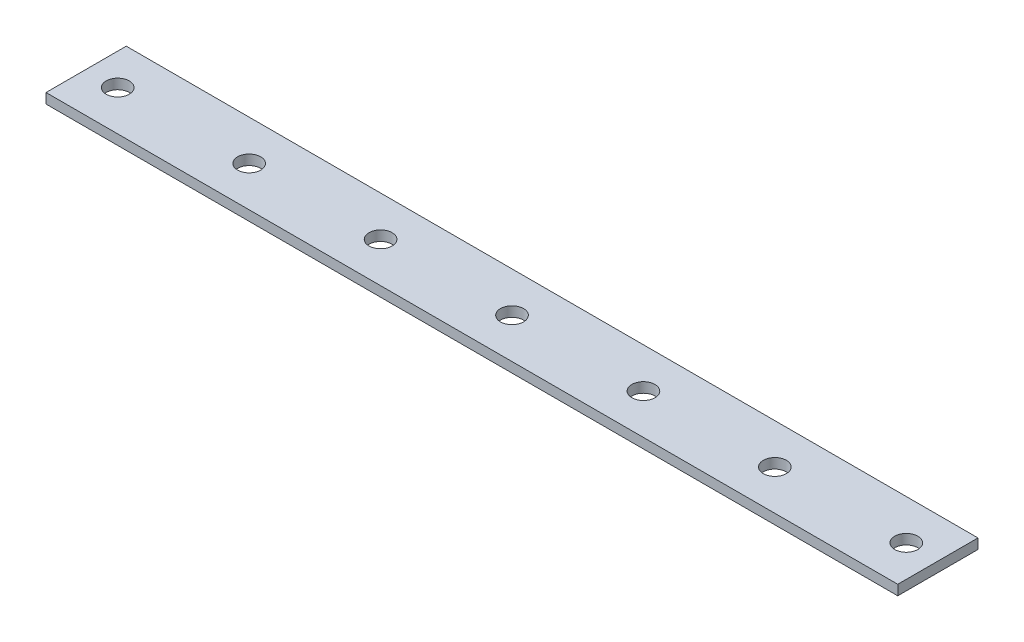
ISO-10303-21;
HEADER;
FILE_DESCRIPTION(('STEP AP214'),'2;1');
FILE_NAME('part.step','',(''),(''),'','','');
FILE_SCHEMA(('AUTOMOTIVE_DESIGN { 1 0 10303 214 1 1 1 1 }'));
ENDSEC;
DATA;
#1=APPLICATION_CONTEXT('core data for automotive mechanical design processes');
#2=APPLICATION_PROTOCOL_DEFINITION('international standard','automotive_design',2000,#1);
#3=PRODUCT_CONTEXT('',#1,'mechanical');
#4=PRODUCT('Part','Part','',(#3));
#5=PRODUCT_RELATED_PRODUCT_CATEGORY('part','',(#4));
#6=PRODUCT_DEFINITION_FORMATION('','',#4);
#7=PRODUCT_DEFINITION_CONTEXT('part definition',#1,'design');
#8=PRODUCT_DEFINITION('design','',#6,#7);
#9=PRODUCT_DEFINITION_SHAPE('','',#8);
#10=(LENGTH_UNIT() NAMED_UNIT(*) SI_UNIT(.MILLI.,.METRE.));
#11=(NAMED_UNIT(*) PLANE_ANGLE_UNIT() SI_UNIT($,.RADIAN.));
#12=(NAMED_UNIT(*) SI_UNIT($,.STERADIAN.) SOLID_ANGLE_UNIT());
#13=UNCERTAINTY_MEASURE_WITH_UNIT(LENGTH_MEASURE(1.E-05),#10,'distance_accuracy_value','');
#14=(GEOMETRIC_REPRESENTATION_CONTEXT(3) GLOBAL_UNCERTAINTY_ASSIGNED_CONTEXT((#13)) GLOBAL_UNIT_ASSIGNED_CONTEXT((#10,
#11,#12)) REPRESENTATION_CONTEXT('',''));
#15=CARTESIAN_POINT('',(0.,0.,0.));
#16=DIRECTION('',(0.,0.,1.));
#17=DIRECTION('',(1.,0.,0.));
#18=AXIS2_PLACEMENT_3D('',#15,#16,#17);
#19=CARTESIAN_POINT('',(0.,1.5875,0.));
#20=DIRECTION('',(0.,-1.,0.));
#21=DIRECTION('',(0.,0.,-1.));
#22=AXIS2_PLACEMENT_3D('',#19,#20,#21);
#23=PLANE('',#22);
#24=CARTESIAN_POINT('',(47.6,1.5875,-6.35));
#25=DIRECTION('',(0.,1.,0.));
#26=DIRECTION('',(0.,0.,1.));
#27=AXIS2_PLACEMENT_3D('',#24,#25,#26);
#28=CIRCLE('',#27,1.8288);
#29=CARTESIAN_POINT('',(47.6,1.5875,-4.52120000000001));
#30=VERTEX_POINT('',#29);
#31=EDGE_CURVE('E150',#30,#30,#28,.T.);
#32=ORIENTED_EDGE('',*,*,#31,.F.);
#33=EDGE_LOOP('',(#32));
#34=FACE_BOUND('',#33,.T.);
#35=CARTESIAN_POINT('',(68.4,1.5875,-6.35));
#36=DIRECTION('',(0.,1.,0.));
#37=DIRECTION('',(0.,0.,1.));
#38=AXIS2_PLACEMENT_3D('',#35,#36,#37);
#39=CIRCLE('',#38,1.8288);
#40=CARTESIAN_POINT('',(68.4,1.5875,-4.5212));
#41=VERTEX_POINT('',#40);
#42=EDGE_CURVE('E144',#41,#41,#39,.T.);
#43=ORIENTED_EDGE('',*,*,#42,.F.);
#44=EDGE_LOOP('',(#43));
#45=FACE_BOUND('',#44,.T.);
#46=CARTESIAN_POINT('',(89.2,1.5875,-6.35));
#47=DIRECTION('',(0.,1.,0.));
#48=DIRECTION('',(0.,0.,1.));
#49=AXIS2_PLACEMENT_3D('',#46,#47,#48);
#50=CIRCLE('',#49,1.8288);
#51=CARTESIAN_POINT('',(89.2,1.5875,-4.5212));
#52=VERTEX_POINT('',#51);
#53=EDGE_CURVE('E138',#52,#52,#50,.T.);
#54=ORIENTED_EDGE('',*,*,#53,.F.);
#55=EDGE_LOOP('',(#54));
#56=FACE_BOUND('',#55,.T.);
#57=CARTESIAN_POINT('',(110.,1.5875,-6.35));
#58=DIRECTION('',(0.,1.,0.));
#59=DIRECTION('',(0.,0.,1.));
#60=AXIS2_PLACEMENT_3D('',#57,#58,#59);
#61=CIRCLE('',#60,1.8288);
#62=CARTESIAN_POINT('',(110.,1.5875,-4.5212));
#63=VERTEX_POINT('',#62);
#64=EDGE_CURVE('E132',#63,#63,#61,.T.);
#65=ORIENTED_EDGE('',*,*,#64,.F.);
#66=EDGE_LOOP('',(#65));
#67=FACE_BOUND('',#66,.T.);
#68=CARTESIAN_POINT('',(26.8,1.5875,-6.35));
#69=DIRECTION('',(0.,1.,0.));
#70=DIRECTION('',(0.,0.,1.));
#71=AXIS2_PLACEMENT_3D('',#68,#69,#70);
#72=CIRCLE('',#71,1.8288);
#73=CARTESIAN_POINT('',(26.8,1.5875,-4.52120000000001));
#74=VERTEX_POINT('',#73);
#75=EDGE_CURVE('E126',#74,#74,#72,.T.);
#76=ORIENTED_EDGE('',*,*,#75,.F.);
#77=EDGE_LOOP('',(#76));
#78=FACE_BOUND('',#77,.T.);
#79=DIRECTION('',(0.,0.,1.));
#80=VECTOR('',#79,1.);
#81=CARTESIAN_POINT('',(1.00000000000001,1.5875,0.));
#82=LINE('',#81,#80);
#83=CARTESIAN_POINT('',(1.,1.5875,-12.7));
#84=VERTEX_POINT('',#83);
#85=CARTESIAN_POINT('',(1.00000000000001,1.5875,0.));
#86=VERTEX_POINT('',#85);
#87=EDGE_CURVE('E87',#84,#86,#82,.T.);
#88=ORIENTED_EDGE('',*,*,#87,.T.);
#89=DIRECTION('',(1.,0.,0.));
#90=VECTOR('',#89,1.);
#91=CARTESIAN_POINT('',(1.00000000000001,1.5875,0.));
#92=LINE('',#91,#90);
#93=CARTESIAN_POINT('',(135.8,1.5875,0.));
#94=VERTEX_POINT('',#93);
#95=EDGE_CURVE('E82',#86,#94,#92,.T.);
#96=ORIENTED_EDGE('',*,*,#95,.T.);
#97=DIRECTION('',(0.,0.,-1.));
#98=VECTOR('',#97,1.);
#99=CARTESIAN_POINT('',(135.8,1.5875,0.));
#100=LINE('',#99,#98);
#101=CARTESIAN_POINT('',(135.8,1.5875,-12.7));
#102=VERTEX_POINT('',#101);
#103=EDGE_CURVE('E85',#94,#102,#100,.T.);
#104=ORIENTED_EDGE('',*,*,#103,.T.);
#105=DIRECTION('',(-1.,0.,0.));
#106=VECTOR('',#105,1.);
#107=CARTESIAN_POINT('',(1.,1.5875,-12.7));
#108=LINE('',#107,#106);
#109=EDGE_CURVE('E52',#102,#84,#108,.T.);
#110=ORIENTED_EDGE('',*,*,#109,.T.);
#111=EDGE_LOOP('',(#88,#96,#104,#110));
#112=FACE_BOUND('',#111,.T.);
#113=CARTESIAN_POINT('',(6.,1.5875,-6.35));
#114=DIRECTION('',(0.,1.,0.));
#115=DIRECTION('',(0.,0.,1.));
#116=AXIS2_PLACEMENT_3D('',#113,#114,#115);
#117=CIRCLE('',#116,1.8288);
#118=CARTESIAN_POINT('',(6.,1.5875,-4.5212));
#119=VERTEX_POINT('',#118);
#120=EDGE_CURVE('E102',#119,#119,#117,.T.);
#121=ORIENTED_EDGE('',*,*,#120,.F.);
#122=EDGE_LOOP('',(#121));
#123=FACE_BOUND('',#122,.T.);
#124=CARTESIAN_POINT('',(130.8,1.5875,-6.35));
#125=DIRECTION('',(0.,1.,0.));
#126=DIRECTION('',(0.,0.,1.));
#127=AXIS2_PLACEMENT_3D('',#124,#125,#126);
#128=CIRCLE('',#127,1.82879999999998);
#129=CARTESIAN_POINT('',(130.8,1.5875,-4.52120000000002));
#130=VERTEX_POINT('',#129);
#131=EDGE_CURVE('E117',#130,#130,#128,.T.);
#132=ORIENTED_EDGE('',*,*,#131,.F.);
#133=EDGE_LOOP('',(#132));
#134=FACE_BOUND('',#133,.T.);
#135=ADVANCED_FACE('F35',(#34,#45,#56,#67,#78,#112,#123,#134),#23,.F.);
#136=CARTESIAN_POINT('',(0.,0.,0.));
#137=DIRECTION('',(0.,-1.,0.));
#138=DIRECTION('',(0.,0.,-1.));
#139=AXIS2_PLACEMENT_3D('',#136,#137,#138);
#140=PLANE('',#139);
#141=CARTESIAN_POINT('',(47.6,0.,-6.35));
#142=DIRECTION('',(0.,1.,0.));
#143=DIRECTION('',(0.,0.,1.));
#144=AXIS2_PLACEMENT_3D('',#141,#142,#143);
#145=CIRCLE('',#144,1.8288);
#146=CARTESIAN_POINT('',(47.6,0.,-4.52120000000001));
#147=VERTEX_POINT('',#146);
#148=EDGE_CURVE('E129',#147,#147,#145,.T.);
#149=ORIENTED_EDGE('',*,*,#148,.T.);
#150=EDGE_LOOP('',(#149));
#151=FACE_BOUND('',#150,.T.);
#152=CARTESIAN_POINT('',(68.4,0.,-6.35));
#153=DIRECTION('',(0.,1.,0.));
#154=DIRECTION('',(0.,0.,1.));
#155=AXIS2_PLACEMENT_3D('',#152,#153,#154);
#156=CIRCLE('',#155,1.8288);
#157=CARTESIAN_POINT('',(68.4,0.,-4.5212));
#158=VERTEX_POINT('',#157);
#159=EDGE_CURVE('E147',#158,#158,#156,.T.);
#160=ORIENTED_EDGE('',*,*,#159,.T.);
#161=EDGE_LOOP('',(#160));
#162=FACE_BOUND('',#161,.T.);
#163=CARTESIAN_POINT('',(89.2,0.,-6.35));
#164=DIRECTION('',(0.,1.,0.));
#165=DIRECTION('',(0.,0.,1.));
#166=AXIS2_PLACEMENT_3D('',#163,#164,#165);
#167=CIRCLE('',#166,1.8288);
#168=CARTESIAN_POINT('',(89.2,0.,-4.5212));
#169=VERTEX_POINT('',#168);
#170=EDGE_CURVE('E141',#169,#169,#167,.T.);
#171=ORIENTED_EDGE('',*,*,#170,.T.);
#172=EDGE_LOOP('',(#171));
#173=FACE_BOUND('',#172,.T.);
#174=CARTESIAN_POINT('',(110.,0.,-6.35));
#175=DIRECTION('',(0.,1.,0.));
#176=DIRECTION('',(0.,0.,1.));
#177=AXIS2_PLACEMENT_3D('',#174,#175,#176);
#178=CIRCLE('',#177,1.8288);
#179=CARTESIAN_POINT('',(110.,0.,-4.5212));
#180=VERTEX_POINT('',#179);
#181=EDGE_CURVE('E135',#180,#180,#178,.T.);
#182=ORIENTED_EDGE('',*,*,#181,.T.);
#183=EDGE_LOOP('',(#182));
#184=FACE_BOUND('',#183,.T.);
#185=CARTESIAN_POINT('',(26.8,0.,-6.35));
#186=DIRECTION('',(0.,1.,0.));
#187=DIRECTION('',(0.,0.,1.));
#188=AXIS2_PLACEMENT_3D('',#185,#186,#187);
#189=CIRCLE('',#188,1.8288);
#190=CARTESIAN_POINT('',(26.8,0.,-4.52120000000001));
#191=VERTEX_POINT('',#190);
#192=EDGE_CURVE('E123',#191,#191,#189,.T.);
#193=ORIENTED_EDGE('',*,*,#192,.T.);
#194=EDGE_LOOP('',(#193));
#195=FACE_BOUND('',#194,.T.);
#196=CARTESIAN_POINT('',(6.,0.,-6.35));
#197=DIRECTION('',(0.,1.,0.));
#198=DIRECTION('',(0.,0.,1.));
#199=AXIS2_PLACEMENT_3D('',#196,#197,#198);
#200=CIRCLE('',#199,1.8288);
#201=CARTESIAN_POINT('',(6.,0.,-4.5212));
#202=VERTEX_POINT('',#201);
#203=EDGE_CURVE('E114',#202,#202,#200,.T.);
#204=ORIENTED_EDGE('',*,*,#203,.T.);
#205=EDGE_LOOP('',(#204));
#206=FACE_BOUND('',#205,.T.);
#207=DIRECTION('',(0.,0.,1.));
#208=VECTOR('',#207,1.);
#209=CARTESIAN_POINT('',(1.00000000000001,0.,0.));
#210=LINE('',#209,#208);
#211=CARTESIAN_POINT('',(1.,0.,-12.7));
#212=VERTEX_POINT('',#211);
#213=CARTESIAN_POINT('',(1.00000000000001,0.,0.));
#214=VERTEX_POINT('',#213);
#215=EDGE_CURVE('E99',#212,#214,#210,.T.);
#216=ORIENTED_EDGE('',*,*,#215,.F.);
#217=DIRECTION('',(-1.,0.,0.));
#218=VECTOR('',#217,1.);
#219=CARTESIAN_POINT('',(1.,0.,-12.7));
#220=LINE('',#219,#218);
#221=CARTESIAN_POINT('',(135.8,0.,-12.7));
#222=VERTEX_POINT('',#221);
#223=EDGE_CURVE('E75',#222,#212,#220,.T.);
#224=ORIENTED_EDGE('',*,*,#223,.F.);
#225=DIRECTION('',(0.,0.,-1.));
#226=VECTOR('',#225,1.);
#227=CARTESIAN_POINT('',(135.8,0.,0.));
#228=LINE('',#227,#226);
#229=CARTESIAN_POINT('',(135.8,0.,0.));
#230=VERTEX_POINT('',#229);
#231=EDGE_CURVE('E69',#230,#222,#228,.T.);
#232=ORIENTED_EDGE('',*,*,#231,.F.);
#233=DIRECTION('',(1.,0.,0.));
#234=VECTOR('',#233,1.);
#235=CARTESIAN_POINT('',(1.00000000000001,0.,0.));
#236=LINE('',#235,#234);
#237=EDGE_CURVE('E91',#214,#230,#236,.T.);
#238=ORIENTED_EDGE('',*,*,#237,.F.);
#239=EDGE_LOOP('',(#216,#224,#232,#238));
#240=FACE_BOUND('',#239,.T.);
#241=CARTESIAN_POINT('',(130.8,0.,-6.35));
#242=DIRECTION('',(0.,1.,0.));
#243=DIRECTION('',(0.,0.,1.));
#244=AXIS2_PLACEMENT_3D('',#241,#242,#243);
#245=CIRCLE('',#244,1.82879999999998);
#246=CARTESIAN_POINT('',(130.8,0.,-4.52120000000002));
#247=VERTEX_POINT('',#246);
#248=EDGE_CURVE('E120',#247,#247,#245,.T.);
#249=ORIENTED_EDGE('',*,*,#248,.T.);
#250=EDGE_LOOP('',(#249));
#251=FACE_BOUND('',#250,.T.);
#252=ADVANCED_FACE('F110',(#151,#162,#173,#184,#195,#206,#240,#251),#140,.T.);
#253=CARTESIAN_POINT('',(1.00000000000001,1.5875,0.));
#254=DIRECTION('',(1.,0.,0.));
#255=DIRECTION('',(0.,0.,-1.));
#256=AXIS2_PLACEMENT_3D('',#253,#254,#255);
#257=PLANE('',#256);
#258=ORIENTED_EDGE('',*,*,#215,.T.);
#259=DIRECTION('',(0.,-1.,0.));
#260=VECTOR('',#259,1.);
#261=CARTESIAN_POINT('',(1.00000000000001,1.5875,0.));
#262=LINE('',#261,#260);
#263=EDGE_CURVE('E11',#86,#214,#262,.T.);
#264=ORIENTED_EDGE('',*,*,#263,.F.);
#265=ORIENTED_EDGE('',*,*,#87,.F.);
#266=DIRECTION('',(0.,-1.,0.));
#267=VECTOR('',#266,1.);
#268=CARTESIAN_POINT('',(1.,1.5875,-12.7));
#269=LINE('',#268,#267);
#270=EDGE_CURVE('E95',#84,#212,#269,.T.);
#271=ORIENTED_EDGE('',*,*,#270,.T.);
#272=EDGE_LOOP('',(#258,#264,#265,#271));
#273=FACE_BOUND('',#272,.T.);
#274=ADVANCED_FACE('F37',(#273),#257,.F.);
#275=CARTESIAN_POINT('',(1.00000000000001,1.5875,0.));
#276=DIRECTION('',(0.,0.,-1.));
#277=DIRECTION('',(-1.,0.,0.));
#278=AXIS2_PLACEMENT_3D('',#275,#276,#277);
#279=PLANE('',#278);
#280=ORIENTED_EDGE('',*,*,#237,.T.);
#281=DIRECTION('',(0.,-1.,0.));
#282=VECTOR('',#281,1.);
#283=CARTESIAN_POINT('',(135.8,1.5875,0.));
#284=LINE('',#283,#282);
#285=EDGE_CURVE('E44',#94,#230,#284,.T.);
#286=ORIENTED_EDGE('',*,*,#285,.F.);
#287=ORIENTED_EDGE('',*,*,#95,.F.);
#288=ORIENTED_EDGE('',*,*,#263,.T.);
#289=EDGE_LOOP('',(#280,#286,#287,#288));
#290=FACE_BOUND('',#289,.T.);
#291=ADVANCED_FACE('F90',(#290),#279,.F.);
#292=CARTESIAN_POINT('',(135.8,1.5875,0.));
#293=DIRECTION('',(-1.,0.,0.));
#294=DIRECTION('',(0.,0.,1.));
#295=AXIS2_PLACEMENT_3D('',#292,#293,#294);
#296=PLANE('',#295);
#297=ORIENTED_EDGE('',*,*,#231,.T.);
#298=DIRECTION('',(0.,-1.,0.));
#299=VECTOR('',#298,1.);
#300=CARTESIAN_POINT('',(135.8,1.5875,-12.7));
#301=LINE('',#300,#299);
#302=EDGE_CURVE('E92',#102,#222,#301,.T.);
#303=ORIENTED_EDGE('',*,*,#302,.F.);
#304=ORIENTED_EDGE('',*,*,#103,.F.);
#305=ORIENTED_EDGE('',*,*,#285,.T.);
#306=EDGE_LOOP('',(#297,#303,#304,#305));
#307=FACE_BOUND('',#306,.T.);
#308=ADVANCED_FACE('F93',(#307),#296,.F.);
#309=CARTESIAN_POINT('',(1.,1.5875,-12.7));
#310=DIRECTION('',(0.,0.,1.));
#311=DIRECTION('',(1.,0.,0.));
#312=AXIS2_PLACEMENT_3D('',#309,#310,#311);
#313=PLANE('',#312);
#314=ORIENTED_EDGE('',*,*,#223,.T.);
#315=ORIENTED_EDGE('',*,*,#270,.F.);
#316=ORIENTED_EDGE('',*,*,#109,.F.);
#317=ORIENTED_EDGE('',*,*,#302,.T.);
#318=EDGE_LOOP('',(#314,#315,#316,#317));
#319=FACE_BOUND('',#318,.T.);
#320=ADVANCED_FACE('F107',(#319),#313,.F.);
#321=CARTESIAN_POINT('',(6.,1.5875,-6.35));
#322=DIRECTION('',(0.,-1.,0.));
#323=DIRECTION('',(0.,0.,-1.));
#324=AXIS2_PLACEMENT_3D('',#321,#322,#323);
#325=CYLINDRICAL_SURFACE('',#324,1.8288);
#326=ORIENTED_EDGE('',*,*,#120,.T.);
#327=EDGE_LOOP('',(#326));
#328=FACE_BOUND('',#327,.T.);
#329=ORIENTED_EDGE('',*,*,#203,.F.);
#330=EDGE_LOOP('',(#329));
#331=FACE_BOUND('',#330,.T.);
#332=ADVANCED_FACE('F189',(#328,#331),#325,.F.);
#333=CARTESIAN_POINT('',(130.8,1.5875,-6.35));
#334=DIRECTION('',(0.,-1.,0.));
#335=DIRECTION('',(0.,0.,-1.));
#336=AXIS2_PLACEMENT_3D('',#333,#334,#335);
#337=CYLINDRICAL_SURFACE('',#336,1.82879999999998);
#338=ORIENTED_EDGE('',*,*,#131,.T.);
#339=EDGE_LOOP('',(#338));
#340=FACE_BOUND('',#339,.T.);
#341=ORIENTED_EDGE('',*,*,#248,.F.);
#342=EDGE_LOOP('',(#341));
#343=FACE_BOUND('',#342,.T.);
#344=ADVANCED_FACE('F179',(#340,#343),#337,.F.);
#345=CARTESIAN_POINT('',(26.8,0.,-6.35));
#346=DIRECTION('',(0.,1.,0.));
#347=DIRECTION('',(0.,0.,1.));
#348=AXIS2_PLACEMENT_3D('',#345,#346,#347);
#349=CYLINDRICAL_SURFACE('',#348,1.8288);
#350=ORIENTED_EDGE('',*,*,#192,.F.);
#351=EDGE_LOOP('',(#350));
#352=FACE_BOUND('',#351,.T.);
#353=ORIENTED_EDGE('',*,*,#75,.T.);
#354=EDGE_LOOP('',(#353));
#355=FACE_BOUND('',#354,.T.);
#356=ADVANCED_FACE('F176',(#352,#355),#349,.F.);
#357=CARTESIAN_POINT('',(110.,0.,-6.35));
#358=DIRECTION('',(0.,1.,0.));
#359=DIRECTION('',(0.,0.,1.));
#360=AXIS2_PLACEMENT_3D('',#357,#358,#359);
#361=CYLINDRICAL_SURFACE('',#360,1.8288);
#362=ORIENTED_EDGE('',*,*,#181,.F.);
#363=EDGE_LOOP('',(#362));
#364=FACE_BOUND('',#363,.T.);
#365=ORIENTED_EDGE('',*,*,#64,.T.);
#366=EDGE_LOOP('',(#365));
#367=FACE_BOUND('',#366,.T.);
#368=ADVANCED_FACE('F178',(#364,#367),#361,.F.);
#369=CARTESIAN_POINT('',(89.2,0.,-6.35));
#370=DIRECTION('',(0.,1.,0.));
#371=DIRECTION('',(0.,0.,1.));
#372=AXIS2_PLACEMENT_3D('',#369,#370,#371);
#373=CYLINDRICAL_SURFACE('',#372,1.8288);
#374=ORIENTED_EDGE('',*,*,#170,.F.);
#375=EDGE_LOOP('',(#374));
#376=FACE_BOUND('',#375,.T.);
#377=ORIENTED_EDGE('',*,*,#53,.T.);
#378=EDGE_LOOP('',(#377));
#379=FACE_BOUND('',#378,.T.);
#380=ADVANCED_FACE('F186',(#376,#379),#373,.F.);
#381=CARTESIAN_POINT('',(68.4,0.,-6.35));
#382=DIRECTION('',(0.,1.,0.));
#383=DIRECTION('',(0.,0.,1.));
#384=AXIS2_PLACEMENT_3D('',#381,#382,#383);
#385=CYLINDRICAL_SURFACE('',#384,1.8288);
#386=ORIENTED_EDGE('',*,*,#159,.F.);
#387=EDGE_LOOP('',(#386));
#388=FACE_BOUND('',#387,.T.);
#389=ORIENTED_EDGE('',*,*,#42,.T.);
#390=EDGE_LOOP('',(#389));
#391=FACE_BOUND('',#390,.T.);
#392=ADVANCED_FACE('F161',(#388,#391),#385,.F.);
#393=CARTESIAN_POINT('',(47.6,0.,-6.35));
#394=DIRECTION('',(0.,1.,0.));
#395=DIRECTION('',(0.,0.,1.));
#396=AXIS2_PLACEMENT_3D('',#393,#394,#395);
#397=CYLINDRICAL_SURFACE('',#396,1.8288);
#398=ORIENTED_EDGE('',*,*,#148,.F.);
#399=EDGE_LOOP('',(#398));
#400=FACE_BOUND('',#399,.T.);
#401=ORIENTED_EDGE('',*,*,#31,.T.);
#402=EDGE_LOOP('',(#401));
#403=FACE_BOUND('',#402,.T.);
#404=ADVANCED_FACE('F158',(#400,#403),#397,.F.);
#405=CLOSED_SHELL('',(#135,#252,#274,#291,#308,#320,#332,#344,#356,#368,#380,#392,#404));
#406=MANIFOLD_SOLID_BREP('B2',#405);
#407=ADVANCED_BREP_SHAPE_REPRESENTATION('',(#18,#406),#14);
#408=SHAPE_DEFINITION_REPRESENTATION(#9,#407);
ENDSEC;
END-ISO-10303-21;
